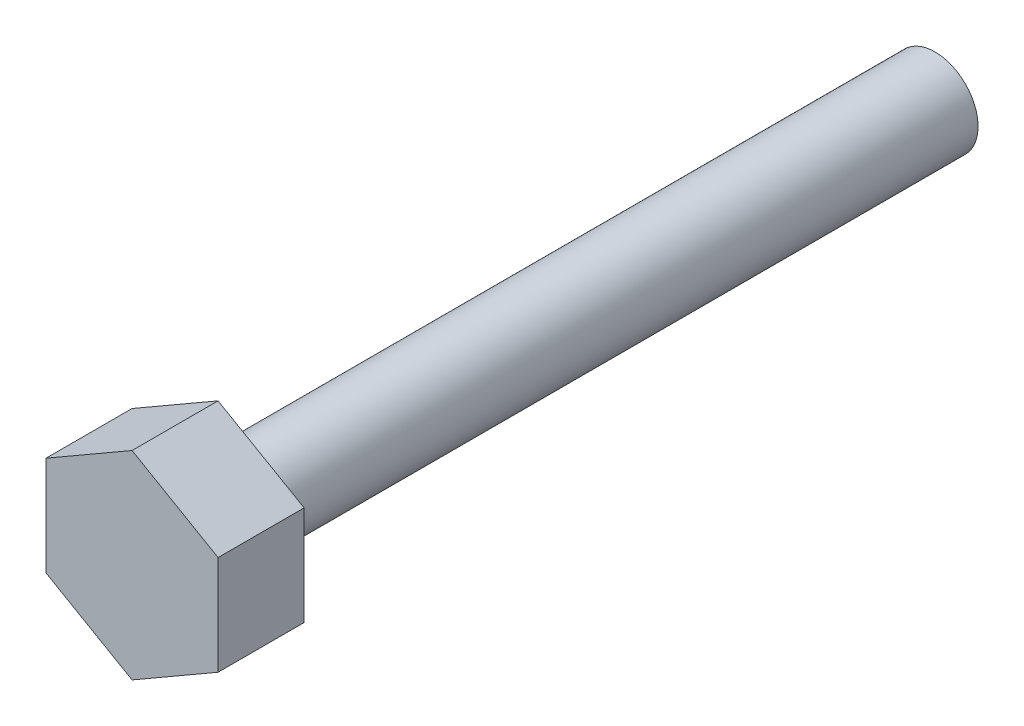
ISO-10303-21;
HEADER;
FILE_DESCRIPTION(('STEP AP214'),'2;1');
FILE_NAME('part.step','',(''),(''),'','','');
FILE_SCHEMA(('AUTOMOTIVE_DESIGN { 1 0 10303 214 1 1 1 1 }'));
ENDSEC;
DATA;
#1=APPLICATION_CONTEXT('core data for automotive mechanical design processes');
#2=APPLICATION_PROTOCOL_DEFINITION('international standard','automotive_design',2000,#1);
#3=PRODUCT_CONTEXT('',#1,'mechanical');
#4=PRODUCT('Part','Part','',(#3));
#5=PRODUCT_RELATED_PRODUCT_CATEGORY('part','',(#4));
#6=PRODUCT_DEFINITION_FORMATION('','',#4);
#7=PRODUCT_DEFINITION_CONTEXT('part definition',#1,'design');
#8=PRODUCT_DEFINITION('design','',#6,#7);
#9=PRODUCT_DEFINITION_SHAPE('','',#8);
#10=(LENGTH_UNIT() NAMED_UNIT(*) SI_UNIT(.MILLI.,.METRE.));
#11=(NAMED_UNIT(*) PLANE_ANGLE_UNIT() SI_UNIT($,.RADIAN.));
#12=(NAMED_UNIT(*) SI_UNIT($,.STERADIAN.) SOLID_ANGLE_UNIT());
#13=UNCERTAINTY_MEASURE_WITH_UNIT(LENGTH_MEASURE(1.E-05),#10,'distance_accuracy_value','');
#14=(GEOMETRIC_REPRESENTATION_CONTEXT(3) GLOBAL_UNCERTAINTY_ASSIGNED_CONTEXT((#13)) GLOBAL_UNIT_ASSIGNED_CONTEXT((#10,
#11,#12)) REPRESENTATION_CONTEXT('',''));
#15=CARTESIAN_POINT('',(0.,0.,0.));
#16=DIRECTION('',(0.,0.,1.));
#17=DIRECTION('',(1.,0.,0.));
#18=AXIS2_PLACEMENT_3D('',#15,#16,#17);
#19=CARTESIAN_POINT('',(5.99999999999995,3.46410161513782,3.));
#20=DIRECTION('',(-0.499999999999995,-0.866025403784441,0.));
#21=DIRECTION('',(0.866025403784442,-0.499999999999995,0.));
#22=AXIS2_PLACEMENT_3D('',#19,#20,#21);
#23=PLANE('',#22);
#24=DIRECTION('',(-0.866025403784442,0.499999999999995,0.));
#25=VECTOR('',#24,1.);
#26=CARTESIAN_POINT('',(5.99999999999995,3.46410161513782,-3.));
#27=LINE('',#26,#25);
#28=CARTESIAN_POINT('',(5.99999999999995,3.46410161513782,-3.));
#29=VERTEX_POINT('',#28);
#30=CARTESIAN_POINT('',(0.,6.9282032302755,-3.));
#31=VERTEX_POINT('',#30);
#32=EDGE_CURVE('E122',#29,#31,#27,.T.);
#33=ORIENTED_EDGE('',*,*,#32,.T.);
#34=DIRECTION('',(0.,0.,-1.));
#35=VECTOR('',#34,1.);
#36=CARTESIAN_POINT('',(0.,6.9282032302755,3.));
#37=LINE('',#36,#35);
#38=CARTESIAN_POINT('',(0.,6.9282032302755,3.));
#39=VERTEX_POINT('',#38);
#40=EDGE_CURVE('E39',#39,#31,#37,.T.);
#41=ORIENTED_EDGE('',*,*,#40,.F.);
#42=DIRECTION('',(-0.866025403784442,0.499999999999995,0.));
#43=VECTOR('',#42,1.);
#44=CARTESIAN_POINT('',(5.99999999999995,3.46410161513782,3.));
#45=LINE('',#44,#43);
#46=CARTESIAN_POINT('',(5.99999999999995,3.46410161513782,3.));
#47=VERTEX_POINT('',#46);
#48=EDGE_CURVE('E133',#47,#39,#45,.T.);
#49=ORIENTED_EDGE('',*,*,#48,.F.);
#50=DIRECTION('',(0.,0.,-1.));
#51=VECTOR('',#50,1.);
#52=CARTESIAN_POINT('',(5.99999999999995,3.46410161513782,3.));
#53=LINE('',#52,#51);
#54=EDGE_CURVE('E118',#47,#29,#53,.T.);
#55=ORIENTED_EDGE('',*,*,#54,.T.);
#56=EDGE_LOOP('',(#33,#41,#49,#55));
#57=FACE_BOUND('',#56,.T.);
#58=ADVANCED_FACE('F36',(#57),#23,.F.);
#59=CARTESIAN_POINT('',(0.,6.9282032302755,3.));
#60=DIRECTION('',(0.500000000000001,-0.866025403784438,0.));
#61=DIRECTION('',(0.866025403784438,0.500000000000001,0.));
#62=AXIS2_PLACEMENT_3D('',#59,#60,#61);
#63=PLANE('',#62);
#64=DIRECTION('',(-0.866025403784438,-0.500000000000001,0.));
#65=VECTOR('',#64,1.);
#66=CARTESIAN_POINT('',(0.,6.9282032302755,-3.));
#67=LINE('',#66,#65);
#68=CARTESIAN_POINT('',(-6.,3.46410161513774,-3.));
#69=VERTEX_POINT('',#68);
#70=EDGE_CURVE('E125',#31,#69,#67,.T.);
#71=ORIENTED_EDGE('',*,*,#70,.T.);
#72=DIRECTION('',(0.,0.,-1.));
#73=VECTOR('',#72,1.);
#74=CARTESIAN_POINT('',(-6.,3.46410161513774,3.));
#75=LINE('',#74,#73);
#76=CARTESIAN_POINT('',(-6.,3.46410161513774,3.));
#77=VERTEX_POINT('',#76);
#78=EDGE_CURVE('E136',#77,#69,#75,.T.);
#79=ORIENTED_EDGE('',*,*,#78,.F.);
#80=DIRECTION('',(-0.866025403784438,-0.500000000000001,0.));
#81=VECTOR('',#80,1.);
#82=CARTESIAN_POINT('',(0.,6.9282032302755,3.));
#83=LINE('',#82,#81);
#84=EDGE_CURVE('E91',#39,#77,#83,.T.);
#85=ORIENTED_EDGE('',*,*,#84,.F.);
#86=ORIENTED_EDGE('',*,*,#40,.T.);
#87=EDGE_LOOP('',(#71,#79,#85,#86));
#88=FACE_BOUND('',#87,.T.);
#89=ADVANCED_FACE('F141',(#88),#63,.F.);
#90=CARTESIAN_POINT('',(-6.,3.46410161513774,3.));
#91=DIRECTION('',(1.,0.,0.));
#92=DIRECTION('',(0.,1.,0.));
#93=AXIS2_PLACEMENT_3D('',#90,#91,#92);
#94=PLANE('',#93);
#95=DIRECTION('',(0.,-1.,0.));
#96=VECTOR('',#95,1.);
#97=CARTESIAN_POINT('',(-6.,3.46410161513774,-3.));
#98=LINE('',#97,#96);
#99=CARTESIAN_POINT('',(-5.99999999999998,-3.46410161513778,-3.));
#100=VERTEX_POINT('',#99);
#101=EDGE_CURVE('E128',#69,#100,#98,.T.);
#102=ORIENTED_EDGE('',*,*,#101,.T.);
#103=DIRECTION('',(0.,0.,-1.));
#104=VECTOR('',#103,1.);
#105=CARTESIAN_POINT('',(-5.99999999999998,-3.46410161513778,3.));
#106=LINE('',#105,#104);
#107=CARTESIAN_POINT('',(-5.99999999999998,-3.46410161513778,3.));
#108=VERTEX_POINT('',#107);
#109=EDGE_CURVE('E113',#108,#100,#106,.T.);
#110=ORIENTED_EDGE('',*,*,#109,.F.);
#111=DIRECTION('',(0.,-1.,0.));
#112=VECTOR('',#111,1.);
#113=CARTESIAN_POINT('',(-6.,3.46410161513774,3.));
#114=LINE('',#113,#112);
#115=EDGE_CURVE('E104',#77,#108,#114,.T.);
#116=ORIENTED_EDGE('',*,*,#115,.F.);
#117=ORIENTED_EDGE('',*,*,#78,.T.);
#118=EDGE_LOOP('',(#102,#110,#116,#117));
#119=FACE_BOUND('',#118,.T.);
#120=ADVANCED_FACE('F147',(#119),#94,.F.);
#121=CARTESIAN_POINT('',(-5.99999999999998,-3.46410161513778,3.));
#122=DIRECTION('',(0.499999999999995,0.866025403784441,0.));
#123=DIRECTION('',(-0.866025403784442,0.499999999999995,0.));
#124=AXIS2_PLACEMENT_3D('',#121,#122,#123);
#125=PLANE('',#124);
#126=DIRECTION('',(0.866025403784442,-0.499999999999995,0.));
#127=VECTOR('',#126,1.);
#128=CARTESIAN_POINT('',(-5.99999999999998,-3.46410161513778,-3.));
#129=LINE('',#128,#127);
#130=CARTESIAN_POINT('',(0.,-6.9282032302755,-3.));
#131=VERTEX_POINT('',#130);
#132=EDGE_CURVE('E112',#100,#131,#129,.T.);
#133=ORIENTED_EDGE('',*,*,#132,.T.);
#134=DIRECTION('',(0.,0.,-1.));
#135=VECTOR('',#134,1.);
#136=CARTESIAN_POINT('',(0.,-6.9282032302755,3.));
#137=LINE('',#136,#135);
#138=CARTESIAN_POINT('',(0.,-6.9282032302755,3.));
#139=VERTEX_POINT('',#138);
#140=EDGE_CURVE('E109',#139,#131,#137,.T.);
#141=ORIENTED_EDGE('',*,*,#140,.F.);
#142=DIRECTION('',(0.866025403784442,-0.499999999999995,0.));
#143=VECTOR('',#142,1.);
#144=CARTESIAN_POINT('',(-5.99999999999998,-3.46410161513778,3.));
#145=LINE('',#144,#143);
#146=EDGE_CURVE('E98',#108,#139,#145,.T.);
#147=ORIENTED_EDGE('',*,*,#146,.F.);
#148=ORIENTED_EDGE('',*,*,#109,.T.);
#149=EDGE_LOOP('',(#133,#141,#147,#148));
#150=FACE_BOUND('',#149,.T.);
#151=ADVANCED_FACE('F110',(#150),#125,.F.);
#152=CARTESIAN_POINT('',(0.,-6.9282032302755,3.));
#153=DIRECTION('',(-0.500000000000007,0.866025403784435,0.));
#154=DIRECTION('',(-0.866025403784434,-0.500000000000007,0.));
#155=AXIS2_PLACEMENT_3D('',#152,#153,#154);
#156=PLANE('',#155);
#157=DIRECTION('',(0.866025403784435,0.500000000000007,0.));
#158=VECTOR('',#157,1.);
#159=CARTESIAN_POINT('',(0.,-6.9282032302755,-3.));
#160=LINE('',#159,#158);
#161=CARTESIAN_POINT('',(6.00000000000002,-3.46410161513769,-3.));
#162=VERTEX_POINT('',#161);
#163=EDGE_CURVE('E76',#131,#162,#160,.T.);
#164=ORIENTED_EDGE('',*,*,#163,.T.);
#165=DIRECTION('',(0.,0.,-1.));
#166=VECTOR('',#165,1.);
#167=CARTESIAN_POINT('',(6.00000000000002,-3.46410161513769,3.));
#168=LINE('',#167,#166);
#169=CARTESIAN_POINT('',(6.00000000000002,-3.46410161513769,3.));
#170=VERTEX_POINT('',#169);
#171=EDGE_CURVE('E114',#170,#162,#168,.T.);
#172=ORIENTED_EDGE('',*,*,#171,.F.);
#173=DIRECTION('',(0.866025403784435,0.500000000000007,0.));
#174=VECTOR('',#173,1.);
#175=CARTESIAN_POINT('',(0.,-6.9282032302755,3.));
#176=LINE('',#175,#174);
#177=EDGE_CURVE('E102',#139,#170,#176,.T.);
#178=ORIENTED_EDGE('',*,*,#177,.F.);
#179=ORIENTED_EDGE('',*,*,#140,.T.);
#180=EDGE_LOOP('',(#164,#172,#178,#179));
#181=FACE_BOUND('',#180,.T.);
#182=ADVANCED_FACE('F116',(#181),#156,.F.);
#183=CARTESIAN_POINT('',(6.00000000000002,-3.46410161513769,3.));
#184=DIRECTION('',(-1.,0.,0.));
#185=DIRECTION('',(0.,-1.,0.));
#186=AXIS2_PLACEMENT_3D('',#183,#184,#185);
#187=PLANE('',#186);
#188=DIRECTION('',(0.,1.,0.));
#189=VECTOR('',#188,1.);
#190=CARTESIAN_POINT('',(6.00000000000002,-3.46410161513769,-3.));
#191=LINE('',#190,#189);
#192=EDGE_CURVE('E82',#162,#29,#191,.T.);
#193=ORIENTED_EDGE('',*,*,#192,.T.);
#194=ORIENTED_EDGE('',*,*,#54,.F.);
#195=DIRECTION('',(0.,1.,0.));
#196=VECTOR('',#195,1.);
#197=CARTESIAN_POINT('',(6.00000000000002,-3.46410161513769,3.));
#198=LINE('',#197,#196);
#199=EDGE_CURVE('E53',#170,#47,#198,.T.);
#200=ORIENTED_EDGE('',*,*,#199,.F.);
#201=ORIENTED_EDGE('',*,*,#171,.T.);
#202=EDGE_LOOP('',(#193,#194,#200,#201));
#203=FACE_BOUND('',#202,.T.);
#204=ADVANCED_FACE('F167',(#203),#187,.F.);
#205=CARTESIAN_POINT('',(0.,0.,3.));
#206=DIRECTION('',(0.,0.,1.));
#207=DIRECTION('',(1.,0.,0.));
#208=AXIS2_PLACEMENT_3D('',#205,#206,#207);
#209=PLANE('',#208);
#210=ORIENTED_EDGE('',*,*,#48,.T.);
#211=ORIENTED_EDGE('',*,*,#84,.T.);
#212=ORIENTED_EDGE('',*,*,#115,.T.);
#213=ORIENTED_EDGE('',*,*,#146,.T.);
#214=ORIENTED_EDGE('',*,*,#177,.T.);
#215=ORIENTED_EDGE('',*,*,#199,.T.);
#216=EDGE_LOOP('',(#210,#211,#212,#213,#214,#215));
#217=FACE_BOUND('',#216,.T.);
#218=ADVANCED_FACE('F100',(#217),#209,.T.);
#219=CARTESIAN_POINT('',(0.,0.,-3.));
#220=DIRECTION('',(0.,0.,1.));
#221=DIRECTION('',(1.,0.,0.));
#222=AXIS2_PLACEMENT_3D('',#219,#220,#221);
#223=PLANE('',#222);
#224=CARTESIAN_POINT('',(0.,0.,-3.));
#225=DIRECTION('',(0.,0.,-1.));
#226=DIRECTION('',(-1.,0.,0.));
#227=AXIS2_PLACEMENT_3D('',#224,#225,#226);
#228=CIRCLE('',#227,3.);
#229=CARTESIAN_POINT('',(-3.,0.,-3.));
#230=VERTEX_POINT('',#229);
#231=EDGE_CURVE('E11',#230,#230,#228,.T.);
#232=ORIENTED_EDGE('',*,*,#231,.F.);
#233=EDGE_LOOP('',(#232));
#234=FACE_BOUND('',#233,.T.);
#235=ORIENTED_EDGE('',*,*,#32,.F.);
#236=ORIENTED_EDGE('',*,*,#192,.F.);
#237=ORIENTED_EDGE('',*,*,#163,.F.);
#238=ORIENTED_EDGE('',*,*,#132,.F.);
#239=ORIENTED_EDGE('',*,*,#101,.F.);
#240=ORIENTED_EDGE('',*,*,#70,.F.);
#241=EDGE_LOOP('',(#235,#236,#237,#238,#239,#240));
#242=FACE_BOUND('',#241,.T.);
#243=ADVANCED_FACE('F146',(#234,#242),#223,.F.);
#244=CARTESIAN_POINT('',(0.,0.,-53.));
#245=DIRECTION('',(0.,0.,1.));
#246=DIRECTION('',(1.,0.,0.));
#247=AXIS2_PLACEMENT_3D('',#244,#245,#246);
#248=CYLINDRICAL_SURFACE('',#247,3.);
#249=CARTESIAN_POINT('',(0.,0.,-53.));
#250=DIRECTION('',(0.,0.,-1.));
#251=DIRECTION('',(-1.,0.,0.));
#252=AXIS2_PLACEMENT_3D('',#249,#250,#251);
#253=CIRCLE('',#252,3.);
#254=CARTESIAN_POINT('',(-3.,0.,-53.));
#255=VERTEX_POINT('',#254);
#256=EDGE_CURVE('E126',#255,#255,#253,.T.);
#257=ORIENTED_EDGE('',*,*,#256,.F.);
#258=EDGE_LOOP('',(#257));
#259=FACE_BOUND('',#258,.T.);
#260=ORIENTED_EDGE('',*,*,#231,.T.);
#261=EDGE_LOOP('',(#260));
#262=FACE_BOUND('',#261,.T.);
#263=ADVANCED_FACE('F156',(#259,#262),#248,.T.);
#264=CARTESIAN_POINT('',(0.,0.,-53.));
#265=DIRECTION('',(0.,0.,-1.));
#266=DIRECTION('',(-1.,0.,0.));
#267=AXIS2_PLACEMENT_3D('',#264,#265,#266);
#268=PLANE('',#267);
#269=ORIENTED_EDGE('',*,*,#256,.T.);
#270=EDGE_LOOP('',(#269));
#271=FACE_BOUND('',#270,.T.);
#272=ADVANCED_FACE('F154',(#271),#268,.T.);
#273=CLOSED_SHELL('',(#58,#89,#120,#151,#182,#204,#218,#243,#263,#272));
#274=MANIFOLD_SOLID_BREP('B2',#273);
#275=ADVANCED_BREP_SHAPE_REPRESENTATION('',(#18,#274),#14);
#276=SHAPE_DEFINITION_REPRESENTATION(#9,#275);
ENDSEC;
END-ISO-10303-21;
